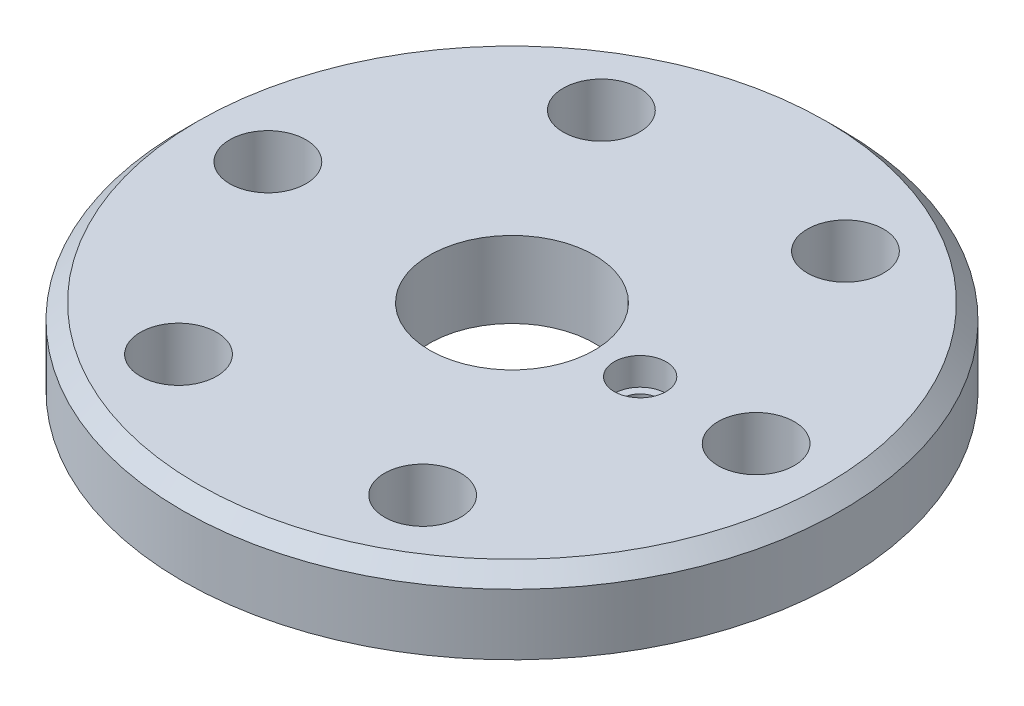
ISO-10303-21;
HEADER;
FILE_DESCRIPTION(('STEP AP214'),'2;1');
FILE_NAME('part.step','',(''),(''),'','','');
FILE_SCHEMA(('AUTOMOTIVE_DESIGN { 1 0 10303 214 1 1 1 1 }'));
ENDSEC;
DATA;
#1=APPLICATION_CONTEXT('core data for automotive mechanical design processes');
#2=APPLICATION_PROTOCOL_DEFINITION('international standard','automotive_design',2000,#1);
#3=PRODUCT_CONTEXT('',#1,'mechanical');
#4=PRODUCT('Part','Part','',(#3));
#5=PRODUCT_RELATED_PRODUCT_CATEGORY('part','',(#4));
#6=PRODUCT_DEFINITION_FORMATION('','',#4);
#7=PRODUCT_DEFINITION_CONTEXT('part definition',#1,'design');
#8=PRODUCT_DEFINITION('design','',#6,#7);
#9=PRODUCT_DEFINITION_SHAPE('','',#8);
#10=(LENGTH_UNIT() NAMED_UNIT(*) SI_UNIT(.MILLI.,.METRE.));
#11=(NAMED_UNIT(*) PLANE_ANGLE_UNIT() SI_UNIT($,.RADIAN.));
#12=(NAMED_UNIT(*) SI_UNIT($,.STERADIAN.) SOLID_ANGLE_UNIT());
#13=UNCERTAINTY_MEASURE_WITH_UNIT(LENGTH_MEASURE(1.E-05),#10,'distance_accuracy_value','');
#14=(GEOMETRIC_REPRESENTATION_CONTEXT(3) GLOBAL_UNCERTAINTY_ASSIGNED_CONTEXT((#13)) GLOBAL_UNIT_ASSIGNED_CONTEXT((#10,
#11,#12)) REPRESENTATION_CONTEXT('',''));
#15=CARTESIAN_POINT('',(0.,0.,0.));
#16=DIRECTION('',(0.,0.,1.));
#17=DIRECTION('',(1.,0.,0.));
#18=AXIS2_PLACEMENT_3D('',#15,#16,#17);
#19=CARTESIAN_POINT('',(42.,0.,0.));
#20=DIRECTION('',(0.,-1.,0.));
#21=DIRECTION('',(0.,0.,-1.));
#22=AXIS2_PLACEMENT_3D('',#19,#20,#21);
#23=CYLINDRICAL_SURFACE('',#22,5.825);
#24=CARTESIAN_POINT('',(42.,0.,0.));
#25=DIRECTION('',(0.,-1.,0.));
#26=DIRECTION('',(0.,0.,-1.));
#27=AXIS2_PLACEMENT_3D('',#24,#25,#26);
#28=CIRCLE('',#27,5.825);
#29=CARTESIAN_POINT('',(42.,0.,-5.82500000000002));
#30=VERTEX_POINT('',#29);
#31=EDGE_CURVE('E77',#30,#30,#28,.T.);
#32=ORIENTED_EDGE('',*,*,#31,.T.);
#33=EDGE_LOOP('',(#32));
#34=FACE_BOUND('',#33,.T.);
#35=CARTESIAN_POINT('',(42.,16.,0.));
#36=DIRECTION('',(0.,1.,0.));
#37=DIRECTION('',(0.,0.,1.));
#38=AXIS2_PLACEMENT_3D('',#35,#36,#37);
#39=CIRCLE('',#38,5.825);
#40=CARTESIAN_POINT('',(42.,16.,5.82499999999998));
#41=VERTEX_POINT('',#40);
#42=EDGE_CURVE('E41',#41,#41,#39,.F.);
#43=ORIENTED_EDGE('',*,*,#42,.F.);
#44=EDGE_LOOP('',(#43));
#45=FACE_BOUND('',#44,.T.);
#46=ADVANCED_FACE('F36',(#34,#45),#23,.F.);
#47=CARTESIAN_POINT('',(40.0000000000001,25.,-69.282032302755));
#48=DIRECTION('',(0.,-1.,0.));
#49=DIRECTION('',(0.,0.,-1.));
#50=AXIS2_PLACEMENT_3D('',#47,#48,#49);
#51=CYLINDRICAL_SURFACE('',#50,12.5);
#52=CARTESIAN_POINT('',(40.0000000000001,25.,-69.282032302755));
#53=DIRECTION('',(0.,1.,0.));
#54=DIRECTION('',(0.,0.,1.));
#55=AXIS2_PLACEMENT_3D('',#52,#53,#54);
#56=CIRCLE('',#55,12.5);
#57=CARTESIAN_POINT('',(40.0000000000001,25.,-56.782032302755));
#58=VERTEX_POINT('',#57);
#59=EDGE_CURVE('E49',#58,#58,#56,.T.);
#60=ORIENTED_EDGE('',*,*,#59,.T.);
#61=EDGE_LOOP('',(#60));
#62=FACE_BOUND('',#61,.T.);
#63=CARTESIAN_POINT('',(40.0000000000001,0.,-69.282032302755));
#64=DIRECTION('',(0.,1.,0.));
#65=DIRECTION('',(0.,0.,1.));
#66=AXIS2_PLACEMENT_3D('',#63,#64,#65);
#67=CIRCLE('',#66,12.5);
#68=CARTESIAN_POINT('',(40.0000000000001,0.,-56.782032302755));
#69=VERTEX_POINT('',#68);
#70=EDGE_CURVE('E56',#69,#69,#67,.T.);
#71=ORIENTED_EDGE('',*,*,#70,.F.);
#72=EDGE_LOOP('',(#71));
#73=FACE_BOUND('',#72,.T.);
#74=ADVANCED_FACE('F112',(#62,#73),#51,.F.);
#75=CARTESIAN_POINT('',(80.000000000003,25.,-1.61987053408125E-12));
#76=DIRECTION('',(0.,-1.,0.));
#77=DIRECTION('',(0.,0.,-1.));
#78=AXIS2_PLACEMENT_3D('',#75,#76,#77);
#79=CYLINDRICAL_SURFACE('',#78,12.4999999999991);
#80=CARTESIAN_POINT('',(80.000000000003,25.,-1.61987053408125E-12));
#81=DIRECTION('',(0.,1.,0.));
#82=DIRECTION('',(0.,0.,1.));
#83=AXIS2_PLACEMENT_3D('',#80,#81,#82);
#84=CIRCLE('',#83,12.4999999999991);
#85=CARTESIAN_POINT('',(80.000000000003,25.,12.4999999999975));
#86=VERTEX_POINT('',#85);
#87=EDGE_CURVE('E80',#86,#86,#84,.T.);
#88=ORIENTED_EDGE('',*,*,#87,.T.);
#89=EDGE_LOOP('',(#88));
#90=FACE_BOUND('',#89,.T.);
#91=CARTESIAN_POINT('',(80.000000000003,0.,-1.61987053408125E-12));
#92=DIRECTION('',(0.,1.,0.));
#93=DIRECTION('',(0.,0.,1.));
#94=AXIS2_PLACEMENT_3D('',#91,#92,#93);
#95=CIRCLE('',#94,12.4999999999991);
#96=CARTESIAN_POINT('',(80.000000000003,0.,12.4999999999975));
#97=VERTEX_POINT('',#96);
#98=EDGE_CURVE('E59',#97,#97,#95,.T.);
#99=ORIENTED_EDGE('',*,*,#98,.F.);
#100=EDGE_LOOP('',(#99));
#101=FACE_BOUND('',#100,.T.);
#102=ADVANCED_FACE('F120',(#90,#101),#79,.F.);
#103=CARTESIAN_POINT('',(40.0000000000058,25.,69.2820323027552));
#104=DIRECTION('',(0.,-1.,0.));
#105=DIRECTION('',(0.,0.,-1.));
#106=AXIS2_PLACEMENT_3D('',#103,#104,#105);
#107=CYLINDRICAL_SURFACE('',#106,12.5000000000015);
#108=CARTESIAN_POINT('',(40.0000000000058,25.,69.2820323027552));
#109=DIRECTION('',(0.,1.,0.));
#110=DIRECTION('',(0.,0.,1.));
#111=AXIS2_PLACEMENT_3D('',#108,#109,#110);
#112=CIRCLE('',#111,12.5000000000015);
#113=CARTESIAN_POINT('',(40.0000000000058,25.,81.7820323027567));
#114=VERTEX_POINT('',#113);
#115=EDGE_CURVE('E83',#114,#114,#112,.T.);
#116=ORIENTED_EDGE('',*,*,#115,.T.);
#117=EDGE_LOOP('',(#116));
#118=FACE_BOUND('',#117,.T.);
#119=CARTESIAN_POINT('',(40.0000000000058,0.,69.2820323027552));
#120=DIRECTION('',(0.,1.,0.));
#121=DIRECTION('',(0.,0.,1.));
#122=AXIS2_PLACEMENT_3D('',#119,#120,#121);
#123=CIRCLE('',#122,12.5000000000015);
#124=CARTESIAN_POINT('',(40.0000000000058,0.,81.7820323027567));
#125=VERTEX_POINT('',#124);
#126=EDGE_CURVE('E62',#125,#125,#123,.T.);
#127=ORIENTED_EDGE('',*,*,#126,.F.);
#128=EDGE_LOOP('',(#127));
#129=FACE_BOUND('',#128,.T.);
#130=ADVANCED_FACE('F141',(#118,#129),#107,.F.);
#131=CARTESIAN_POINT('',(-39.9999999999942,25.,69.2820323027585));
#132=DIRECTION('',(0.,-1.,0.));
#133=DIRECTION('',(0.,0.,-1.));
#134=AXIS2_PLACEMENT_3D('',#131,#132,#133);
#135=CYLINDRICAL_SURFACE('',#134,12.500000000005);
#136=CARTESIAN_POINT('',(-39.9999999999942,25.,69.2820323027585));
#137=DIRECTION('',(0.,1.,0.));
#138=DIRECTION('',(0.,0.,1.));
#139=AXIS2_PLACEMENT_3D('',#136,#137,#138);
#140=CIRCLE('',#139,12.500000000005);
#141=CARTESIAN_POINT('',(-39.9999999999942,25.,81.7820323027634));
#142=VERTEX_POINT('',#141);
#143=EDGE_CURVE('E86',#142,#142,#140,.T.);
#144=ORIENTED_EDGE('',*,*,#143,.T.);
#145=EDGE_LOOP('',(#144));
#146=FACE_BOUND('',#145,.T.);
#147=CARTESIAN_POINT('',(-39.9999999999942,0.,69.2820323027585));
#148=DIRECTION('',(0.,1.,0.));
#149=DIRECTION('',(0.,0.,1.));
#150=AXIS2_PLACEMENT_3D('',#147,#148,#149);
#151=CIRCLE('',#150,12.500000000005);
#152=CARTESIAN_POINT('',(-39.9999999999942,0.,81.7820323027634));
#153=VERTEX_POINT('',#152);
#154=EDGE_CURVE('E65',#153,#153,#151,.T.);
#155=ORIENTED_EDGE('',*,*,#154,.F.);
#156=EDGE_LOOP('',(#155));
#157=FACE_BOUND('',#156,.T.);
#158=ADVANCED_FACE('F145',(#146,#157),#135,.F.);
#159=CARTESIAN_POINT('',(-79.9999999999971,25.,5.0487162713917E-12));
#160=DIRECTION('',(0.,-1.,0.));
#161=DIRECTION('',(0.,0.,-1.));
#162=AXIS2_PLACEMENT_3D('',#159,#160,#161);
#163=CYLINDRICAL_SURFACE('',#162,12.5000000000061);
#164=CARTESIAN_POINT('',(-79.9999999999971,25.,5.0487162713917E-12));
#165=DIRECTION('',(0.,1.,0.));
#166=DIRECTION('',(0.,0.,1.));
#167=AXIS2_PLACEMENT_3D('',#164,#165,#166);
#168=CIRCLE('',#167,12.5000000000061);
#169=CARTESIAN_POINT('',(-79.9999999999971,25.,12.5000000000112));
#170=VERTEX_POINT('',#169);
#171=EDGE_CURVE('E89',#170,#170,#168,.T.);
#172=ORIENTED_EDGE('',*,*,#171,.T.);
#173=EDGE_LOOP('',(#172));
#174=FACE_BOUND('',#173,.T.);
#175=CARTESIAN_POINT('',(-79.9999999999971,0.,5.0487162713917E-12));
#176=DIRECTION('',(0.,1.,0.));
#177=DIRECTION('',(0.,0.,1.));
#178=AXIS2_PLACEMENT_3D('',#175,#176,#177);
#179=CIRCLE('',#178,12.5000000000061);
#180=CARTESIAN_POINT('',(-79.9999999999971,0.,12.5000000000112));
#181=VERTEX_POINT('',#180);
#182=EDGE_CURVE('E68',#181,#181,#179,.T.);
#183=ORIENTED_EDGE('',*,*,#182,.F.);
#184=EDGE_LOOP('',(#183));
#185=FACE_BOUND('',#184,.T.);
#186=ADVANCED_FACE('F149',(#174,#185),#163,.F.);
#187=CARTESIAN_POINT('',(-40.,25.,-69.2820323027517));
#188=DIRECTION('',(0.,-1.,0.));
#189=DIRECTION('',(0.,0.,-1.));
#190=AXIS2_PLACEMENT_3D('',#187,#188,#189);
#191=CYLINDRICAL_SURFACE('',#190,12.500000000004);
#192=CARTESIAN_POINT('',(-40.,25.,-69.2820323027517));
#193=DIRECTION('',(0.,1.,0.));
#194=DIRECTION('',(0.,0.,1.));
#195=AXIS2_PLACEMENT_3D('',#192,#193,#194);
#196=CIRCLE('',#195,12.500000000004);
#197=CARTESIAN_POINT('',(-40.,25.,-56.7820323027477));
#198=VERTEX_POINT('',#197);
#199=EDGE_CURVE('E92',#198,#198,#196,.T.);
#200=ORIENTED_EDGE('',*,*,#199,.T.);
#201=EDGE_LOOP('',(#200));
#202=FACE_BOUND('',#201,.T.);
#203=CARTESIAN_POINT('',(-40.,0.,-69.2820323027517));
#204=DIRECTION('',(0.,1.,0.));
#205=DIRECTION('',(0.,0.,1.));
#206=AXIS2_PLACEMENT_3D('',#203,#204,#205);
#207=CIRCLE('',#206,12.500000000004);
#208=CARTESIAN_POINT('',(-40.,0.,-56.7820323027477));
#209=VERTEX_POINT('',#208);
#210=EDGE_CURVE('E71',#209,#209,#207,.T.);
#211=ORIENTED_EDGE('',*,*,#210,.F.);
#212=EDGE_LOOP('',(#211));
#213=FACE_BOUND('',#212,.T.);
#214=ADVANCED_FACE('F153',(#202,#213),#191,.F.);
#215=CARTESIAN_POINT('',(0.,25.,0.));
#216=DIRECTION('',(0.,-1.,0.));
#217=DIRECTION('',(0.,0.,-1.));
#218=AXIS2_PLACEMENT_3D('',#215,#216,#217);
#219=CYLINDRICAL_SURFACE('',#218,27.);
#220=CARTESIAN_POINT('',(0.,25.,0.));
#221=DIRECTION('',(0.,1.,0.));
#222=DIRECTION('',(0.,0.,1.));
#223=AXIS2_PLACEMENT_3D('',#220,#221,#222);
#224=CIRCLE('',#223,27.);
#225=CARTESIAN_POINT('',(0.,25.,27.));
#226=VERTEX_POINT('',#225);
#227=EDGE_CURVE('E55',#226,#226,#224,.T.);
#228=ORIENTED_EDGE('',*,*,#227,.T.);
#229=EDGE_LOOP('',(#228));
#230=FACE_BOUND('',#229,.T.);
#231=CARTESIAN_POINT('',(0.,0.,0.));
#232=DIRECTION('',(0.,1.,0.));
#233=DIRECTION('',(0.,0.,1.));
#234=AXIS2_PLACEMENT_3D('',#231,#232,#233);
#235=CIRCLE('',#234,27.);
#236=CARTESIAN_POINT('',(0.,0.,27.));
#237=VERTEX_POINT('',#236);
#238=EDGE_CURVE('E74',#237,#237,#235,.T.);
#239=ORIENTED_EDGE('',*,*,#238,.F.);
#240=EDGE_LOOP('',(#239));
#241=FACE_BOUND('',#240,.T.);
#242=ADVANCED_FACE('F137',(#230,#241),#219,.F.);
#243=CARTESIAN_POINT('',(0.,25.,0.));
#244=DIRECTION('',(0.,-1.,0.));
#245=DIRECTION('',(0.,0.,-1.));
#246=AXIS2_PLACEMENT_3D('',#243,#244,#245);
#247=CYLINDRICAL_SURFACE('',#246,108.);
#248=CARTESIAN_POINT('',(0.,20.,0.));
#249=DIRECTION('',(0.,1.,0.));
#250=DIRECTION('',(0.,0.,1.));
#251=AXIS2_PLACEMENT_3D('',#248,#249,#250);
#252=CIRCLE('',#251,108.);
#253=CARTESIAN_POINT('',(0.,20.,108.));
#254=VERTEX_POINT('',#253);
#255=EDGE_CURVE('E10',#254,#254,#252,.F.);
#256=ORIENTED_EDGE('',*,*,#255,.T.);
#257=EDGE_LOOP('',(#256));
#258=FACE_BOUND('',#257,.T.);
#259=CARTESIAN_POINT('',(0.,0.,0.));
#260=DIRECTION('',(0.,1.,0.));
#261=DIRECTION('',(0.,0.,1.));
#262=AXIS2_PLACEMENT_3D('',#259,#260,#261);
#263=CIRCLE('',#262,108.);
#264=CARTESIAN_POINT('',(0.,0.,108.));
#265=VERTEX_POINT('',#264);
#266=EDGE_CURVE('E52',#265,#265,#263,.T.);
#267=ORIENTED_EDGE('',*,*,#266,.T.);
#268=EDGE_LOOP('',(#267));
#269=FACE_BOUND('',#268,.T.);
#270=ADVANCED_FACE('F131',(#258,#269),#247,.T.);
#271=CARTESIAN_POINT('',(0.,25.,0.));
#272=DIRECTION('',(0.,1.,0.));
#273=DIRECTION('',(0.,0.,1.));
#274=AXIS2_PLACEMENT_3D('',#271,#272,#273);
#275=PLANE('',#274);
#276=CARTESIAN_POINT('',(42.,25.,0.));
#277=DIRECTION('',(0.,1.,0.));
#278=DIRECTION('',(0.,0.,1.));
#279=AXIS2_PLACEMENT_3D('',#276,#277,#278);
#280=CIRCLE('',#279,8.5);
#281=CARTESIAN_POINT('',(42.,25.,8.5));
#282=VERTEX_POINT('',#281);
#283=EDGE_CURVE('E99',#282,#282,#280,.T.);
#284=ORIENTED_EDGE('',*,*,#283,.F.);
#285=EDGE_LOOP('',(#284));
#286=FACE_BOUND('',#285,.T.);
#287=CARTESIAN_POINT('',(0.,25.,0.));
#288=DIRECTION('',(0.,1.,0.));
#289=DIRECTION('',(0.,0.,1.));
#290=AXIS2_PLACEMENT_3D('',#287,#288,#289);
#291=CIRCLE('',#290,103.);
#292=CARTESIAN_POINT('',(0.,25.,103.));
#293=VERTEX_POINT('',#292);
#294=EDGE_CURVE('E45',#293,#293,#291,.T.);
#295=ORIENTED_EDGE('',*,*,#294,.T.);
#296=EDGE_LOOP('',(#295));
#297=FACE_BOUND('',#296,.T.);
#298=ORIENTED_EDGE('',*,*,#227,.F.);
#299=EDGE_LOOP('',(#298));
#300=FACE_BOUND('',#299,.T.);
#301=ORIENTED_EDGE('',*,*,#199,.F.);
#302=EDGE_LOOP('',(#301));
#303=FACE_BOUND('',#302,.T.);
#304=ORIENTED_EDGE('',*,*,#171,.F.);
#305=EDGE_LOOP('',(#304));
#306=FACE_BOUND('',#305,.T.);
#307=ORIENTED_EDGE('',*,*,#143,.F.);
#308=EDGE_LOOP('',(#307));
#309=FACE_BOUND('',#308,.T.);
#310=ORIENTED_EDGE('',*,*,#115,.F.);
#311=EDGE_LOOP('',(#310));
#312=FACE_BOUND('',#311,.T.);
#313=ORIENTED_EDGE('',*,*,#87,.F.);
#314=EDGE_LOOP('',(#313));
#315=FACE_BOUND('',#314,.T.);
#316=ORIENTED_EDGE('',*,*,#59,.F.);
#317=EDGE_LOOP('',(#316));
#318=FACE_BOUND('',#317,.T.);
#319=ADVANCED_FACE('F127',(#286,#297,#300,#303,#306,#309,#312,#315,#318),#275,.T.);
#320=CARTESIAN_POINT('',(0.,0.,0.));
#321=DIRECTION('',(0.,1.,0.));
#322=DIRECTION('',(0.,0.,1.));
#323=AXIS2_PLACEMENT_3D('',#320,#321,#322);
#324=PLANE('',#323);
#325=ORIENTED_EDGE('',*,*,#31,.F.);
#326=EDGE_LOOP('',(#325));
#327=FACE_BOUND('',#326,.T.);
#328=ORIENTED_EDGE('',*,*,#238,.T.);
#329=EDGE_LOOP('',(#328));
#330=FACE_BOUND('',#329,.T.);
#331=ORIENTED_EDGE('',*,*,#210,.T.);
#332=EDGE_LOOP('',(#331));
#333=FACE_BOUND('',#332,.T.);
#334=ORIENTED_EDGE('',*,*,#182,.T.);
#335=EDGE_LOOP('',(#334));
#336=FACE_BOUND('',#335,.T.);
#337=ORIENTED_EDGE('',*,*,#154,.T.);
#338=EDGE_LOOP('',(#337));
#339=FACE_BOUND('',#338,.T.);
#340=ORIENTED_EDGE('',*,*,#126,.T.);
#341=EDGE_LOOP('',(#340));
#342=FACE_BOUND('',#341,.T.);
#343=ORIENTED_EDGE('',*,*,#98,.T.);
#344=EDGE_LOOP('',(#343));
#345=FACE_BOUND('',#344,.T.);
#346=ORIENTED_EDGE('',*,*,#70,.T.);
#347=EDGE_LOOP('',(#346));
#348=FACE_BOUND('',#347,.T.);
#349=ORIENTED_EDGE('',*,*,#266,.F.);
#350=EDGE_LOOP('',(#349));
#351=FACE_BOUND('',#350,.T.);
#352=ADVANCED_FACE('F130',(#327,#330,#333,#336,#339,#342,#345,#348,#351),#324,.F.);
#353=CARTESIAN_POINT('',(0.,25.,0.));
#354=DIRECTION('',(0.,-1.,0.));
#355=DIRECTION('',(0.,0.,-1.));
#356=AXIS2_PLACEMENT_3D('',#353,#354,#355);
#357=CONICAL_SURFACE('',#356,103.,0.78539816339745);
#358=ORIENTED_EDGE('',*,*,#255,.F.);
#359=EDGE_LOOP('',(#358));
#360=FACE_BOUND('',#359,.T.);
#361=ORIENTED_EDGE('',*,*,#294,.F.);
#362=EDGE_LOOP('',(#361));
#363=FACE_BOUND('',#362,.T.);
#364=ADVANCED_FACE('F39',(#360,#363),#357,.T.);
#365=CARTESIAN_POINT('',(42.,16.,0.));
#366=DIRECTION('',(0.,1.,0.));
#367=DIRECTION('',(0.,0.,1.));
#368=AXIS2_PLACEMENT_3D('',#365,#366,#367);
#369=PLANE('',#368);
#370=CARTESIAN_POINT('',(42.,16.,0.));
#371=DIRECTION('',(0.,1.,0.));
#372=DIRECTION('',(0.,0.,1.));
#373=AXIS2_PLACEMENT_3D('',#370,#371,#372);
#374=CIRCLE('',#373,8.5);
#375=CARTESIAN_POINT('',(42.,16.,8.5));
#376=VERTEX_POINT('',#375);
#377=EDGE_CURVE('E102',#376,#376,#374,.T.);
#378=ORIENTED_EDGE('',*,*,#377,.T.);
#379=EDGE_LOOP('',(#378));
#380=FACE_BOUND('',#379,.T.);
#381=ORIENTED_EDGE('',*,*,#42,.T.);
#382=EDGE_LOOP('',(#381));
#383=FACE_BOUND('',#382,.T.);
#384=ADVANCED_FACE('F109',(#380,#383),#369,.T.);
#385=CARTESIAN_POINT('',(42.,16.,0.));
#386=DIRECTION('',(0.,1.,0.));
#387=DIRECTION('',(0.,0.,1.));
#388=AXIS2_PLACEMENT_3D('',#385,#386,#387);
#389=CYLINDRICAL_SURFACE('',#388,8.5);
#390=ORIENTED_EDGE('',*,*,#377,.F.);
#391=EDGE_LOOP('',(#390));
#392=FACE_BOUND('',#391,.T.);
#393=ORIENTED_EDGE('',*,*,#283,.T.);
#394=EDGE_LOOP('',(#393));
#395=FACE_BOUND('',#394,.T.);
#396=ADVANCED_FACE('F125',(#392,#395),#389,.F.);
#397=CLOSED_SHELL('',(#46,#74,#102,#130,#158,#186,#214,#242,#270,#319,#352,#364,#384,#396));
#398=MANIFOLD_SOLID_BREP('B2',#397);
#399=ADVANCED_BREP_SHAPE_REPRESENTATION('',(#18,#398),#14);
#400=SHAPE_DEFINITION_REPRESENTATION(#9,#399);
ENDSEC;
END-ISO-10303-21;
